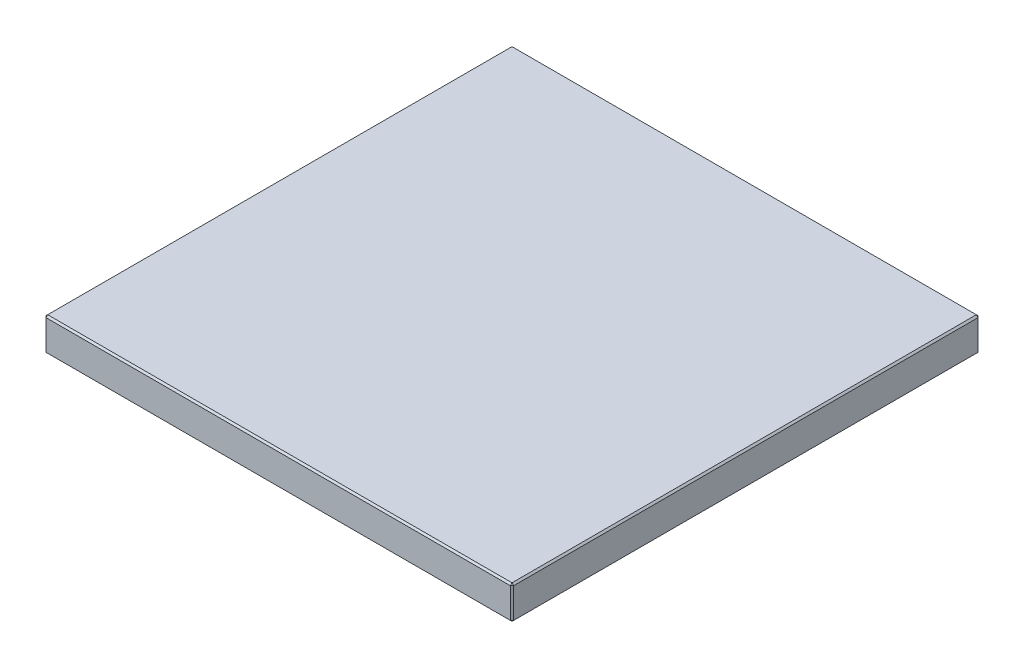
ISO-10303-21;
HEADER;
FILE_DESCRIPTION(('STEP AP214'),'2;1');
FILE_NAME('part.step','',(''),(''),'','','');
FILE_SCHEMA(('AUTOMOTIVE_DESIGN { 1 0 10303 214 1 1 1 1 }'));
ENDSEC;
DATA;
#1=APPLICATION_CONTEXT('core data for automotive mechanical design processes');
#2=APPLICATION_PROTOCOL_DEFINITION('international standard','automotive_design',2000,#1);
#3=PRODUCT_CONTEXT('',#1,'mechanical');
#4=PRODUCT('Part','Part','',(#3));
#5=PRODUCT_RELATED_PRODUCT_CATEGORY('part','',(#4));
#6=PRODUCT_DEFINITION_FORMATION('','',#4);
#7=PRODUCT_DEFINITION_CONTEXT('part definition',#1,'design');
#8=PRODUCT_DEFINITION('design','',#6,#7);
#9=PRODUCT_DEFINITION_SHAPE('','',#8);
#10=(LENGTH_UNIT() NAMED_UNIT(*) SI_UNIT(.MILLI.,.METRE.));
#11=(NAMED_UNIT(*) PLANE_ANGLE_UNIT() SI_UNIT($,.RADIAN.));
#12=(NAMED_UNIT(*) SI_UNIT($,.STERADIAN.) SOLID_ANGLE_UNIT());
#13=UNCERTAINTY_MEASURE_WITH_UNIT(LENGTH_MEASURE(1.E-05),#10,'distance_accuracy_value','');
#14=(GEOMETRIC_REPRESENTATION_CONTEXT(3) GLOBAL_UNCERTAINTY_ASSIGNED_CONTEXT((#13)) GLOBAL_UNIT_ASSIGNED_CONTEXT((#10,
#11,#12)) REPRESENTATION_CONTEXT('',''));
#15=CARTESIAN_POINT('',(0.,0.,0.));
#16=DIRECTION('',(0.,0.,1.));
#17=DIRECTION('',(1.,0.,0.));
#18=AXIS2_PLACEMENT_3D('',#15,#16,#17);
#19=CARTESIAN_POINT('',(44.45,-3.17500000000001,44.45));
#20=DIRECTION('',(-1.,0.,0.));
#21=DIRECTION('',(0.,0.,1.));
#22=AXIS2_PLACEMENT_3D('',#19,#20,#21);
#23=PLANE('',#22);
#24=DIRECTION('',(0.,-1.,0.));
#25=VECTOR('',#24,1.);
#26=CARTESIAN_POINT('',(44.45,-3.17500000000001,44.1325));
#27=LINE('',#26,#25);
#28=CARTESIAN_POINT('',(44.45,2.85750000000002,44.1325));
#29=VERTEX_POINT('',#28);
#30=CARTESIAN_POINT('',(44.45,-2.85750000000001,44.1325));
#31=VERTEX_POINT('',#30);
#32=EDGE_CURVE('E151',#29,#31,#27,.T.);
#33=ORIENTED_EDGE('',*,*,#32,.T.);
#34=DIRECTION('',(0.,0.,-1.));
#35=VECTOR('',#34,1.);
#36=CARTESIAN_POINT('',(44.45,-2.85750000000001,44.45));
#37=LINE('',#36,#35);
#38=CARTESIAN_POINT('',(44.45,-2.85750000000001,-44.1325));
#39=VERTEX_POINT('',#38);
#40=EDGE_CURVE('E218',#31,#39,#37,.T.);
#41=ORIENTED_EDGE('',*,*,#40,.T.);
#42=DIRECTION('',(0.,1.,0.));
#43=VECTOR('',#42,1.);
#44=CARTESIAN_POINT('',(44.45,3.17500000000002,-44.1325));
#45=LINE('',#44,#43);
#46=CARTESIAN_POINT('',(44.45,2.85750000000002,-44.1325));
#47=VERTEX_POINT('',#46);
#48=EDGE_CURVE('E215',#39,#47,#45,.T.);
#49=ORIENTED_EDGE('',*,*,#48,.T.);
#50=DIRECTION('',(0.,0.,1.));
#51=VECTOR('',#50,1.);
#52=CARTESIAN_POINT('',(44.45,2.85750000000002,44.45));
#53=LINE('',#52,#51);
#54=EDGE_CURVE('E210',#47,#29,#53,.T.);
#55=ORIENTED_EDGE('',*,*,#54,.T.);
#56=EDGE_LOOP('',(#33,#41,#49,#55));
#57=FACE_BOUND('',#56,.T.);
#58=ADVANCED_FACE('F41',(#57),#23,.F.);
#59=CARTESIAN_POINT('',(-44.45,3.175,44.45));
#60=DIRECTION('',(0.,-1.,0.));
#61=DIRECTION('',(1.,0.,0.));
#62=AXIS2_PLACEMENT_3D('',#59,#60,#61);
#63=PLANE('',#62);
#64=DIRECTION('',(0.,0.,-1.));
#65=VECTOR('',#64,1.);
#66=CARTESIAN_POINT('',(44.1325,3.17500000000002,44.45));
#67=LINE('',#66,#65);
#68=CARTESIAN_POINT('',(44.1325,3.17500000000002,44.1325));
#69=VERTEX_POINT('',#68);
#70=CARTESIAN_POINT('',(44.1325,3.17500000000002,-44.1325));
#71=VERTEX_POINT('',#70);
#72=EDGE_CURVE('E65',#69,#71,#67,.T.);
#73=ORIENTED_EDGE('',*,*,#72,.T.);
#74=DIRECTION('',(-1.,0.,0.));
#75=VECTOR('',#74,1.);
#76=CARTESIAN_POINT('',(-44.45,3.175,-44.1325));
#77=LINE('',#76,#75);
#78=CARTESIAN_POINT('',(-44.1325,3.175,-44.1325));
#79=VERTEX_POINT('',#78);
#80=EDGE_CURVE('E11',#71,#79,#77,.T.);
#81=ORIENTED_EDGE('',*,*,#80,.T.);
#82=DIRECTION('',(0.,0.,1.));
#83=VECTOR('',#82,1.);
#84=CARTESIAN_POINT('',(-44.1325,3.175,44.45));
#85=LINE('',#84,#83);
#86=CARTESIAN_POINT('',(-44.1325,3.175,44.1325));
#87=VERTEX_POINT('',#86);
#88=EDGE_CURVE('E51',#79,#87,#85,.T.);
#89=ORIENTED_EDGE('',*,*,#88,.T.);
#90=DIRECTION('',(1.,0.,0.));
#91=VECTOR('',#90,1.);
#92=CARTESIAN_POINT('',(-44.45,3.175,44.1325));
#93=LINE('',#92,#91);
#94=EDGE_CURVE('E235',#87,#69,#93,.T.);
#95=ORIENTED_EDGE('',*,*,#94,.T.);
#96=EDGE_LOOP('',(#73,#81,#89,#95));
#97=FACE_BOUND('',#96,.T.);
#98=ADVANCED_FACE('F362',(#97),#63,.F.);
#99=CARTESIAN_POINT('',(-44.45,-3.17500000000002,44.45));
#100=DIRECTION('',(1.,0.,0.));
#101=DIRECTION('',(0.,0.,-1.));
#102=AXIS2_PLACEMENT_3D('',#99,#100,#101);
#103=PLANE('',#102);
#104=DIRECTION('',(0.,0.,1.));
#105=VECTOR('',#104,1.);
#106=CARTESIAN_POINT('',(-44.45,-2.85750000000002,44.45));
#107=LINE('',#106,#105);
#108=CARTESIAN_POINT('',(-44.45,-2.85750000000002,-44.1325));
#109=VERTEX_POINT('',#108);
#110=CARTESIAN_POINT('',(-44.45,-2.85750000000002,44.1325));
#111=VERTEX_POINT('',#110);
#112=EDGE_CURVE('E190',#109,#111,#107,.T.);
#113=ORIENTED_EDGE('',*,*,#112,.T.);
#114=DIRECTION('',(0.,1.,0.));
#115=VECTOR('',#114,1.);
#116=CARTESIAN_POINT('',(-44.45,-3.17500000000002,44.1325));
#117=LINE('',#116,#115);
#118=CARTESIAN_POINT('',(-44.45,2.8575,44.1325));
#119=VERTEX_POINT('',#118);
#120=EDGE_CURVE('E193',#111,#119,#117,.T.);
#121=ORIENTED_EDGE('',*,*,#120,.T.);
#122=DIRECTION('',(0.,0.,-1.));
#123=VECTOR('',#122,1.);
#124=CARTESIAN_POINT('',(-44.45,2.8575,44.45));
#125=LINE('',#124,#123);
#126=CARTESIAN_POINT('',(-44.45,2.8575,-44.1325));
#127=VERTEX_POINT('',#126);
#128=EDGE_CURVE('E184',#119,#127,#125,.T.);
#129=ORIENTED_EDGE('',*,*,#128,.T.);
#130=DIRECTION('',(0.,-1.,0.));
#131=VECTOR('',#130,1.);
#132=CARTESIAN_POINT('',(-44.45,-3.17500000000002,-44.1325));
#133=LINE('',#132,#131);
#134=EDGE_CURVE('E187',#127,#109,#133,.T.);
#135=ORIENTED_EDGE('',*,*,#134,.T.);
#136=EDGE_LOOP('',(#113,#121,#129,#135));
#137=FACE_BOUND('',#136,.T.);
#138=ADVANCED_FACE('F386',(#137),#103,.F.);
#139=CARTESIAN_POINT('',(-44.45,-3.17500000000002,44.45));
#140=DIRECTION('',(0.,1.,0.));
#141=DIRECTION('',(-1.,0.,0.));
#142=AXIS2_PLACEMENT_3D('',#139,#140,#141);
#143=PLANE('',#142);
#144=DIRECTION('',(0.,0.,1.));
#145=VECTOR('',#144,1.);
#146=CARTESIAN_POINT('',(44.1325,-3.17500000000001,44.45));
#147=LINE('',#146,#145);
#148=CARTESIAN_POINT('',(44.1325,-3.17500000000001,-44.1325));
#149=VERTEX_POINT('',#148);
#150=CARTESIAN_POINT('',(44.1325,-3.17500000000001,44.1325));
#151=VERTEX_POINT('',#150);
#152=EDGE_CURVE('E200',#149,#151,#147,.T.);
#153=ORIENTED_EDGE('',*,*,#152,.T.);
#154=DIRECTION('',(-1.,0.,0.));
#155=VECTOR('',#154,1.);
#156=CARTESIAN_POINT('',(-44.45,-3.17500000000002,44.1325));
#157=LINE('',#156,#155);
#158=CARTESIAN_POINT('',(-44.1325,-3.17500000000002,44.1325));
#159=VERTEX_POINT('',#158);
#160=EDGE_CURVE('E207',#151,#159,#157,.T.);
#161=ORIENTED_EDGE('',*,*,#160,.T.);
#162=DIRECTION('',(0.,0.,-1.));
#163=VECTOR('',#162,1.);
#164=CARTESIAN_POINT('',(-44.1325,-3.17500000000002,44.45));
#165=LINE('',#164,#163);
#166=CARTESIAN_POINT('',(-44.1325,-3.17500000000002,-44.1325));
#167=VERTEX_POINT('',#166);
#168=EDGE_CURVE('E203',#159,#167,#165,.T.);
#169=ORIENTED_EDGE('',*,*,#168,.T.);
#170=DIRECTION('',(1.,0.,0.));
#171=VECTOR('',#170,1.);
#172=CARTESIAN_POINT('',(44.45,-3.17500000000001,-44.1325));
#173=LINE('',#172,#171);
#174=EDGE_CURVE('E197',#167,#149,#173,.T.);
#175=ORIENTED_EDGE('',*,*,#174,.T.);
#176=EDGE_LOOP('',(#153,#161,#169,#175));
#177=FACE_BOUND('',#176,.T.);
#178=ADVANCED_FACE('F335',(#177),#143,.F.);
#179=CARTESIAN_POINT('',(0.,0.,44.45));
#180=DIRECTION('',(0.,0.,-1.));
#181=DIRECTION('',(-1.,0.,0.));
#182=AXIS2_PLACEMENT_3D('',#179,#180,#181);
#183=PLANE('',#182);
#184=DIRECTION('',(-1.,0.,0.));
#185=VECTOR('',#184,1.);
#186=CARTESIAN_POINT('',(0.,2.85750000000001,44.45));
#187=LINE('',#186,#185);
#188=CARTESIAN_POINT('',(44.1325,2.85750000000002,44.45));
#189=VERTEX_POINT('',#188);
#190=CARTESIAN_POINT('',(-44.1325,2.8575,44.45));
#191=VERTEX_POINT('',#190);
#192=EDGE_CURVE('E137',#189,#191,#187,.T.);
#193=ORIENTED_EDGE('',*,*,#192,.T.);
#194=DIRECTION('',(0.,-1.,0.));
#195=VECTOR('',#194,1.);
#196=CARTESIAN_POINT('',(-44.1325,0.,44.45));
#197=LINE('',#196,#195);
#198=CARTESIAN_POINT('',(-44.1325,-2.85750000000002,44.45));
#199=VERTEX_POINT('',#198);
#200=EDGE_CURVE('E181',#191,#199,#197,.T.);
#201=ORIENTED_EDGE('',*,*,#200,.T.);
#202=DIRECTION('',(1.,0.,0.));
#203=VECTOR('',#202,1.);
#204=CARTESIAN_POINT('',(0.,-2.85750000000002,44.45));
#205=LINE('',#204,#203);
#206=CARTESIAN_POINT('',(44.1325,-2.85750000000001,44.45));
#207=VERTEX_POINT('',#206);
#208=EDGE_CURVE('E140',#199,#207,#205,.T.);
#209=ORIENTED_EDGE('',*,*,#208,.T.);
#210=DIRECTION('',(0.,1.,0.));
#211=VECTOR('',#210,1.);
#212=CARTESIAN_POINT('',(44.1325,0.,44.45));
#213=LINE('',#212,#211);
#214=EDGE_CURVE('E132',#207,#189,#213,.T.);
#215=ORIENTED_EDGE('',*,*,#214,.T.);
#216=EDGE_LOOP('',(#193,#201,#209,#215));
#217=FACE_BOUND('',#216,.T.);
#218=ADVANCED_FACE('F134',(#217),#183,.F.);
#219=CARTESIAN_POINT('',(0.,0.,-44.45));
#220=DIRECTION('',(0.,0.,-1.));
#221=DIRECTION('',(-1.,0.,0.));
#222=AXIS2_PLACEMENT_3D('',#219,#220,#221);
#223=PLANE('',#222);
#224=DIRECTION('',(0.,-1.,0.));
#225=VECTOR('',#224,1.);
#226=CARTESIAN_POINT('',(44.1325,-3.17500000000001,-44.45));
#227=LINE('',#226,#225);
#228=CARTESIAN_POINT('',(44.1325,2.85750000000002,-44.45));
#229=VERTEX_POINT('',#228);
#230=CARTESIAN_POINT('',(44.1325,-2.85750000000001,-44.45));
#231=VERTEX_POINT('',#230);
#232=EDGE_CURVE('E225',#229,#231,#227,.T.);
#233=ORIENTED_EDGE('',*,*,#232,.T.);
#234=DIRECTION('',(-1.,0.,0.));
#235=VECTOR('',#234,1.);
#236=CARTESIAN_POINT('',(-44.45,-2.85750000000002,-44.45));
#237=LINE('',#236,#235);
#238=CARTESIAN_POINT('',(-44.1325,-2.85750000000002,-44.45));
#239=VERTEX_POINT('',#238);
#240=EDGE_CURVE('E231',#231,#239,#237,.T.);
#241=ORIENTED_EDGE('',*,*,#240,.T.);
#242=DIRECTION('',(0.,1.,0.));
#243=VECTOR('',#242,1.);
#244=CARTESIAN_POINT('',(-44.1325,3.175,-44.45));
#245=LINE('',#244,#243);
#246=CARTESIAN_POINT('',(-44.1325,2.8575,-44.45));
#247=VERTEX_POINT('',#246);
#248=EDGE_CURVE('E228',#239,#247,#245,.T.);
#249=ORIENTED_EDGE('',*,*,#248,.T.);
#250=DIRECTION('',(1.,0.,0.));
#251=VECTOR('',#250,1.);
#252=CARTESIAN_POINT('',(44.45,2.85750000000002,-44.45));
#253=LINE('',#252,#251);
#254=EDGE_CURVE('E222',#247,#229,#253,.T.);
#255=ORIENTED_EDGE('',*,*,#254,.T.);
#256=EDGE_LOOP('',(#233,#241,#249,#255));
#257=FACE_BOUND('',#256,.T.);
#258=ADVANCED_FACE('F351',(#257),#223,.T.);
#259=CARTESIAN_POINT('',(44.45,-3.17500000000001,-44.1325));
#260=DIRECTION('',(0.707106781186548,0.,-0.707106781186548));
#261=DIRECTION('',(0.,-1.,0.));
#262=AXIS2_PLACEMENT_3D('',#259,#260,#261);
#263=PLANE('',#262);
#264=DIRECTION('',(-0.707106781186548,0.,-0.707106781186548));
#265=VECTOR('',#264,1.);
#266=CARTESIAN_POINT('',(44.45,2.85750000000002,-44.1325));
#267=LINE('',#266,#265);
#268=EDGE_CURVE('E45',#47,#229,#267,.T.);
#269=ORIENTED_EDGE('',*,*,#268,.F.);
#270=ORIENTED_EDGE('',*,*,#48,.F.);
#271=DIRECTION('',(0.707106781186547,0.,0.707106781186547));
#272=VECTOR('',#271,1.);
#273=CARTESIAN_POINT('',(44.45,-2.85750000000001,-44.1325));
#274=LINE('',#273,#272);
#275=EDGE_CURVE('E177',#231,#39,#274,.T.);
#276=ORIENTED_EDGE('',*,*,#275,.F.);
#277=ORIENTED_EDGE('',*,*,#232,.F.);
#278=EDGE_LOOP('',(#269,#270,#276,#277));
#279=FACE_BOUND('',#278,.T.);
#280=ADVANCED_FACE('F43',(#279),#263,.T.);
#281=CARTESIAN_POINT('',(44.45,2.85750000000002,-44.1325));
#282=DIRECTION('',(0.577350269189625,0.577350269189626,-0.577350269189626));
#283=DIRECTION('',(0.,0.707106781186548,0.707106781186548));
#284=AXIS2_PLACEMENT_3D('',#281,#282,#283);
#285=PLANE('',#284);
#286=DIRECTION('',(-0.707106781186548,0.707106781186547,0.));
#287=VECTOR('',#286,1.);
#288=CARTESIAN_POINT('',(44.45,2.85750000000002,-44.1325));
#289=LINE('',#288,#287);
#290=EDGE_CURVE('E300',#47,#71,#289,.T.);
#291=ORIENTED_EDGE('',*,*,#290,.F.);
#292=ORIENTED_EDGE('',*,*,#268,.T.);
#293=DIRECTION('',(0.,0.707106781186547,0.707106781186548));
#294=VECTOR('',#293,1.);
#295=CARTESIAN_POINT('',(44.1325,3.01625000000002,-44.29125));
#296=LINE('',#295,#294);
#297=EDGE_CURVE('E303',#71,#229,#296,.F.);
#298=ORIENTED_EDGE('',*,*,#297,.F.);
#299=EDGE_LOOP('',(#291,#292,#298));
#300=FACE_BOUND('',#299,.T.);
#301=ADVANCED_FACE('F355',(#300),#285,.T.);
#302=CARTESIAN_POINT('',(44.45,-2.85750000000001,-44.1325));
#303=DIRECTION('',(0.577350269189626,-0.577350269189626,-0.577350269189626));
#304=DIRECTION('',(-0.707106781186548,0.,-0.707106781186548));
#305=AXIS2_PLACEMENT_3D('',#302,#303,#304);
#306=PLANE('',#305);
#307=DIRECTION('',(0.,0.707106781186548,-0.707106781186548));
#308=VECTOR('',#307,1.);
#309=CARTESIAN_POINT('',(44.1325,-3.01625000000001,-44.29125));
#310=LINE('',#309,#308);
#311=EDGE_CURVE('E293',#231,#149,#310,.F.);
#312=ORIENTED_EDGE('',*,*,#311,.F.);
#313=ORIENTED_EDGE('',*,*,#275,.T.);
#314=DIRECTION('',(0.707106781186547,0.707106781186547,0.));
#315=VECTOR('',#314,1.);
#316=CARTESIAN_POINT('',(44.45,-2.85750000000001,-44.1325));
#317=LINE('',#316,#315);
#318=EDGE_CURVE('E297',#149,#39,#317,.T.);
#319=ORIENTED_EDGE('',*,*,#318,.F.);
#320=EDGE_LOOP('',(#312,#313,#319));
#321=FACE_BOUND('',#320,.T.);
#322=ADVANCED_FACE('F314',(#321),#306,.T.);
#323=CARTESIAN_POINT('',(-44.45,3.175,-44.1325));
#324=DIRECTION('',(0.,0.707106781186548,-0.707106781186547));
#325=DIRECTION('',(1.,0.,0.));
#326=AXIS2_PLACEMENT_3D('',#323,#324,#325);
#327=PLANE('',#326);
#328=ORIENTED_EDGE('',*,*,#297,.T.);
#329=ORIENTED_EDGE('',*,*,#254,.F.);
#330=DIRECTION('',(0.,-0.707106781186547,-0.707106781186548));
#331=VECTOR('',#330,1.);
#332=CARTESIAN_POINT('',(-44.1325,2.8575,-44.45));
#333=LINE('',#332,#331);
#334=EDGE_CURVE('E285',#79,#247,#333,.T.);
#335=ORIENTED_EDGE('',*,*,#334,.F.);
#336=ORIENTED_EDGE('',*,*,#80,.F.);
#337=EDGE_LOOP('',(#328,#329,#335,#336));
#338=FACE_BOUND('',#337,.T.);
#339=ADVANCED_FACE('F359',(#338),#327,.T.);
#340=CARTESIAN_POINT('',(44.1325,3.17500000000002,44.45));
#341=DIRECTION('',(-0.707106781186547,-0.707106781186548,0.));
#342=DIRECTION('',(0.,0.,-1.));
#343=AXIS2_PLACEMENT_3D('',#340,#341,#342);
#344=PLANE('',#343);
#345=ORIENTED_EDGE('',*,*,#290,.T.);
#346=ORIENTED_EDGE('',*,*,#72,.F.);
#347=DIRECTION('',(0.707106781186548,-0.707106781186547,0.));
#348=VECTOR('',#347,1.);
#349=CARTESIAN_POINT('',(44.29125,3.01625000000002,44.1325));
#350=LINE('',#349,#348);
#351=EDGE_CURVE('E156',#29,#69,#350,.F.);
#352=ORIENTED_EDGE('',*,*,#351,.F.);
#353=ORIENTED_EDGE('',*,*,#54,.F.);
#354=EDGE_LOOP('',(#345,#346,#352,#353));
#355=FACE_BOUND('',#354,.T.);
#356=ADVANCED_FACE('F427',(#355),#344,.F.);
#357=CARTESIAN_POINT('',(44.1325,0.,44.45));
#358=DIRECTION('',(-0.707106781186548,0.,-0.707106781186548));
#359=DIRECTION('',(0.,1.,0.));
#360=AXIS2_PLACEMENT_3D('',#357,#358,#359);
#361=PLANE('',#360);
#362=DIRECTION('',(0.707106781186547,0.,-0.707106781186547));
#363=VECTOR('',#362,1.);
#364=CARTESIAN_POINT('',(44.29125,-2.85750000000001,44.29125));
#365=LINE('',#364,#363);
#366=EDGE_CURVE('E157',#31,#207,#365,.F.);
#367=ORIENTED_EDGE('',*,*,#366,.F.);
#368=ORIENTED_EDGE('',*,*,#32,.F.);
#369=DIRECTION('',(-0.707106781186548,0.,0.707106781186548));
#370=VECTOR('',#369,1.);
#371=CARTESIAN_POINT('',(44.1325,2.85750000000002,44.45));
#372=LINE('',#371,#370);
#373=EDGE_CURVE('E148',#189,#29,#372,.F.);
#374=ORIENTED_EDGE('',*,*,#373,.F.);
#375=ORIENTED_EDGE('',*,*,#214,.F.);
#376=EDGE_LOOP('',(#367,#368,#374,#375));
#377=FACE_BOUND('',#376,.T.);
#378=ADVANCED_FACE('F150',(#377),#361,.F.);
#379=CARTESIAN_POINT('',(44.45,-2.85750000000001,44.45));
#380=DIRECTION('',(-0.707106781186548,0.707106781186548,0.));
#381=DIRECTION('',(0.,0.,-1.));
#382=AXIS2_PLACEMENT_3D('',#379,#380,#381);
#383=PLANE('',#382);
#384=ORIENTED_EDGE('',*,*,#318,.T.);
#385=ORIENTED_EDGE('',*,*,#40,.F.);
#386=DIRECTION('',(-0.707106781186547,-0.707106781186547,0.));
#387=VECTOR('',#386,1.);
#388=CARTESIAN_POINT('',(44.1325,-3.17500000000001,44.1325));
#389=LINE('',#388,#387);
#390=EDGE_CURVE('E277',#151,#31,#389,.F.);
#391=ORIENTED_EDGE('',*,*,#390,.F.);
#392=ORIENTED_EDGE('',*,*,#152,.F.);
#393=EDGE_LOOP('',(#384,#385,#391,#392));
#394=FACE_BOUND('',#393,.T.);
#395=ADVANCED_FACE('F325',(#394),#383,.F.);
#396=CARTESIAN_POINT('',(-44.45,-3.17500000000002,-44.1325));
#397=DIRECTION('',(0.,-0.707106781186548,-0.707106781186548));
#398=DIRECTION('',(-1.,0.,0.));
#399=AXIS2_PLACEMENT_3D('',#396,#397,#398);
#400=PLANE('',#399);
#401=ORIENTED_EDGE('',*,*,#311,.T.);
#402=ORIENTED_EDGE('',*,*,#174,.F.);
#403=DIRECTION('',(0.,-0.707106781186547,0.707106781186547));
#404=VECTOR('',#403,1.);
#405=CARTESIAN_POINT('',(-44.1325,-3.17500000000002,-44.1325));
#406=LINE('',#405,#404);
#407=EDGE_CURVE('E273',#239,#167,#406,.T.);
#408=ORIENTED_EDGE('',*,*,#407,.F.);
#409=ORIENTED_EDGE('',*,*,#240,.F.);
#410=EDGE_LOOP('',(#401,#402,#408,#409));
#411=FACE_BOUND('',#410,.T.);
#412=ADVANCED_FACE('F349',(#411),#400,.T.);
#413=CARTESIAN_POINT('',(-44.45,-3.17500000000002,-44.1325));
#414=DIRECTION('',(-0.707106781186548,0.,-0.707106781186548));
#415=DIRECTION('',(0.,1.,0.));
#416=AXIS2_PLACEMENT_3D('',#413,#414,#415);
#417=PLANE('',#416);
#418=DIRECTION('',(-0.707106781186547,0.,0.707106781186547));
#419=VECTOR('',#418,1.);
#420=CARTESIAN_POINT('',(-44.1325,2.8575,-44.45));
#421=LINE('',#420,#419);
#422=EDGE_CURVE('E289',#247,#127,#421,.T.);
#423=ORIENTED_EDGE('',*,*,#422,.F.);
#424=ORIENTED_EDGE('',*,*,#248,.F.);
#425=DIRECTION('',(0.707106781186547,0.,-0.707106781186547));
#426=VECTOR('',#425,1.);
#427=CARTESIAN_POINT('',(-44.29125,-2.85750000000002,-44.29125));
#428=LINE('',#427,#426);
#429=EDGE_CURVE('E270',#109,#239,#428,.T.);
#430=ORIENTED_EDGE('',*,*,#429,.F.);
#431=ORIENTED_EDGE('',*,*,#134,.F.);
#432=EDGE_LOOP('',(#423,#424,#430,#431));
#433=FACE_BOUND('',#432,.T.);
#434=ADVANCED_FACE('F453',(#433),#417,.T.);
#435=CARTESIAN_POINT('',(-44.1325,2.8575,-44.45));
#436=DIRECTION('',(-0.577350269189626,0.577350269189626,-0.577350269189626));
#437=DIRECTION('',(-0.707106781186548,0.,0.707106781186548));
#438=AXIS2_PLACEMENT_3D('',#435,#436,#437);
#439=PLANE('',#438);
#440=ORIENTED_EDGE('',*,*,#334,.T.);
#441=ORIENTED_EDGE('',*,*,#422,.T.);
#442=DIRECTION('',(-0.707106781186547,-0.707106781186547,0.));
#443=VECTOR('',#442,1.);
#444=CARTESIAN_POINT('',(-44.29125,3.01625,-44.1325));
#445=LINE('',#444,#443);
#446=EDGE_CURVE('E165',#79,#127,#445,.T.);
#447=ORIENTED_EDGE('',*,*,#446,.F.);
#448=EDGE_LOOP('',(#440,#441,#447));
#449=FACE_BOUND('',#448,.T.);
#450=ADVANCED_FACE('F460',(#449),#439,.T.);
#451=CARTESIAN_POINT('',(44.1325,2.85750000000002,44.45));
#452=DIRECTION('',(0.577350269189626,0.577350269189626,0.577350269189626));
#453=DIRECTION('',(0.,-0.707106781186547,0.707106781186548));
#454=AXIS2_PLACEMENT_3D('',#451,#452,#453);
#455=PLANE('',#454);
#456=ORIENTED_EDGE('',*,*,#373,.T.);
#457=ORIENTED_EDGE('',*,*,#351,.T.);
#458=DIRECTION('',(0.,0.707106781186547,-0.707106781186548));
#459=VECTOR('',#458,1.);
#460=CARTESIAN_POINT('',(44.1325,2.85750000000002,44.45));
#461=LINE('',#460,#459);
#462=EDGE_CURVE('E160',#189,#69,#461,.T.);
#463=ORIENTED_EDGE('',*,*,#462,.F.);
#464=EDGE_LOOP('',(#456,#457,#463));
#465=FACE_BOUND('',#464,.T.);
#466=ADVANCED_FACE('F161',(#465),#455,.T.);
#467=CARTESIAN_POINT('',(44.1325,-3.17500000000001,44.1325));
#468=DIRECTION('',(0.577350269189626,-0.577350269189626,0.577350269189626));
#469=DIRECTION('',(0.707106781186548,0.,-0.707106781186548));
#470=AXIS2_PLACEMENT_3D('',#467,#468,#469);
#471=PLANE('',#470);
#472=ORIENTED_EDGE('',*,*,#390,.T.);
#473=ORIENTED_EDGE('',*,*,#366,.T.);
#474=DIRECTION('',(0.,0.707106781186548,0.707106781186548));
#475=VECTOR('',#474,1.);
#476=CARTESIAN_POINT('',(44.1325,-3.17500000000001,44.1325));
#477=LINE('',#476,#475);
#478=EDGE_CURVE('E166',#151,#207,#477,.T.);
#479=ORIENTED_EDGE('',*,*,#478,.F.);
#480=EDGE_LOOP('',(#472,#473,#479));
#481=FACE_BOUND('',#480,.T.);
#482=ADVANCED_FACE('F328',(#481),#471,.T.);
#483=CARTESIAN_POINT('',(-44.1325,-3.17500000000002,-44.1325));
#484=DIRECTION('',(-0.577350269189626,-0.577350269189626,-0.577350269189626));
#485=DIRECTION('',(-0.707106781186548,0.,0.707106781186548));
#486=AXIS2_PLACEMENT_3D('',#483,#484,#485);
#487=PLANE('',#486);
#488=ORIENTED_EDGE('',*,*,#429,.T.);
#489=ORIENTED_EDGE('',*,*,#407,.T.);
#490=DIRECTION('',(0.707106781186547,-0.707106781186547,0.));
#491=VECTOR('',#490,1.);
#492=CARTESIAN_POINT('',(-44.1325,-3.17500000000002,-44.1325));
#493=LINE('',#492,#491);
#494=EDGE_CURVE('E262',#109,#167,#493,.T.);
#495=ORIENTED_EDGE('',*,*,#494,.F.);
#496=EDGE_LOOP('',(#488,#489,#495));
#497=FACE_BOUND('',#496,.T.);
#498=ADVANCED_FACE('F345',(#497),#487,.T.);
#499=CARTESIAN_POINT('',(-44.45,2.8575,44.45));
#500=DIRECTION('',(0.707106781186548,-0.707106781186548,0.));
#501=DIRECTION('',(0.,0.,-1.));
#502=AXIS2_PLACEMENT_3D('',#499,#500,#501);
#503=PLANE('',#502);
#504=ORIENTED_EDGE('',*,*,#446,.T.);
#505=ORIENTED_EDGE('',*,*,#128,.F.);
#506=DIRECTION('',(0.707106781186548,0.707106781186548,0.));
#507=VECTOR('',#506,1.);
#508=CARTESIAN_POINT('',(-44.45,2.8575,44.1325));
#509=LINE('',#508,#507);
#510=EDGE_CURVE('E258',#87,#119,#509,.F.);
#511=ORIENTED_EDGE('',*,*,#510,.F.);
#512=ORIENTED_EDGE('',*,*,#88,.F.);
#513=EDGE_LOOP('',(#504,#505,#511,#512));
#514=FACE_BOUND('',#513,.T.);
#515=ADVANCED_FACE('F364',(#514),#503,.F.);
#516=CARTESIAN_POINT('',(0.,2.85750000000001,44.45));
#517=DIRECTION('',(0.,-0.707106781186548,-0.707106781186547));
#518=DIRECTION('',(-1.,0.,0.));
#519=AXIS2_PLACEMENT_3D('',#516,#517,#518);
#520=PLANE('',#519);
#521=ORIENTED_EDGE('',*,*,#462,.T.);
#522=ORIENTED_EDGE('',*,*,#94,.F.);
#523=DIRECTION('',(0.,-0.707106781186547,0.707106781186548));
#524=VECTOR('',#523,1.);
#525=CARTESIAN_POINT('',(-44.1325,3.01625,44.29125));
#526=LINE('',#525,#524);
#527=EDGE_CURVE('E170',#191,#87,#526,.F.);
#528=ORIENTED_EDGE('',*,*,#527,.F.);
#529=ORIENTED_EDGE('',*,*,#192,.F.);
#530=EDGE_LOOP('',(#521,#522,#528,#529));
#531=FACE_BOUND('',#530,.T.);
#532=ADVANCED_FACE('F168',(#531),#520,.F.);
#533=CARTESIAN_POINT('',(0.,-2.85750000000002,44.45));
#534=DIRECTION('',(0.,0.707106781186548,-0.707106781186548));
#535=DIRECTION('',(1.,0.,0.));
#536=AXIS2_PLACEMENT_3D('',#533,#534,#535);
#537=PLANE('',#536);
#538=ORIENTED_EDGE('',*,*,#478,.T.);
#539=ORIENTED_EDGE('',*,*,#208,.F.);
#540=DIRECTION('',(0.,-0.707106781186547,-0.707106781186547));
#541=VECTOR('',#540,1.);
#542=CARTESIAN_POINT('',(-44.1325,-2.85750000000002,44.45));
#543=LINE('',#542,#541);
#544=EDGE_CURVE('E252',#159,#199,#543,.F.);
#545=ORIENTED_EDGE('',*,*,#544,.F.);
#546=ORIENTED_EDGE('',*,*,#160,.F.);
#547=EDGE_LOOP('',(#538,#539,#545,#546));
#548=FACE_BOUND('',#547,.T.);
#549=ADVANCED_FACE('F332',(#548),#537,.F.);
#550=CARTESIAN_POINT('',(-44.1325,-3.17500000000002,44.45));
#551=DIRECTION('',(0.707106781186548,0.707106781186548,0.));
#552=DIRECTION('',(0.,0.,-1.));
#553=AXIS2_PLACEMENT_3D('',#550,#551,#552);
#554=PLANE('',#553);
#555=ORIENTED_EDGE('',*,*,#494,.T.);
#556=ORIENTED_EDGE('',*,*,#168,.F.);
#557=DIRECTION('',(-0.707106781186547,0.707106781186547,0.));
#558=VECTOR('',#557,1.);
#559=CARTESIAN_POINT('',(-44.29125,-3.01625000000002,44.1325));
#560=LINE('',#559,#558);
#561=EDGE_CURVE('E248',#111,#159,#560,.F.);
#562=ORIENTED_EDGE('',*,*,#561,.F.);
#563=ORIENTED_EDGE('',*,*,#112,.F.);
#564=EDGE_LOOP('',(#555,#556,#562,#563));
#565=FACE_BOUND('',#564,.T.);
#566=ADVANCED_FACE('F338',(#565),#554,.F.);
#567=CARTESIAN_POINT('',(-44.45,2.8575,44.1325));
#568=DIRECTION('',(-0.577350269189626,0.577350269189626,0.577350269189625));
#569=DIRECTION('',(-0.707106781186548,-0.707106781186548,0.));
#570=AXIS2_PLACEMENT_3D('',#567,#568,#569);
#571=PLANE('',#570);
#572=ORIENTED_EDGE('',*,*,#527,.T.);
#573=ORIENTED_EDGE('',*,*,#510,.T.);
#574=DIRECTION('',(-0.707106781186548,0.,-0.707106781186548));
#575=VECTOR('',#574,1.);
#576=CARTESIAN_POINT('',(-44.45,2.8575,44.1325));
#577=LINE('',#576,#575);
#578=EDGE_CURVE('E245',#191,#119,#577,.T.);
#579=ORIENTED_EDGE('',*,*,#578,.F.);
#580=EDGE_LOOP('',(#572,#573,#579));
#581=FACE_BOUND('',#580,.T.);
#582=ADVANCED_FACE('F366',(#581),#571,.T.);
#583=CARTESIAN_POINT('',(-44.1325,-2.85750000000002,44.45));
#584=DIRECTION('',(-0.577350269189626,-0.577350269189626,0.577350269189626));
#585=DIRECTION('',(0.707106781186548,0.,0.707106781186548));
#586=AXIS2_PLACEMENT_3D('',#583,#584,#585);
#587=PLANE('',#586);
#588=ORIENTED_EDGE('',*,*,#561,.T.);
#589=ORIENTED_EDGE('',*,*,#544,.T.);
#590=DIRECTION('',(0.707106781186547,0.,0.707106781186547));
#591=VECTOR('',#590,1.);
#592=CARTESIAN_POINT('',(-44.1325,-2.85750000000002,44.45));
#593=LINE('',#592,#591);
#594=EDGE_CURVE('E242',#111,#199,#593,.T.);
#595=ORIENTED_EDGE('',*,*,#594,.F.);
#596=EDGE_LOOP('',(#588,#589,#595));
#597=FACE_BOUND('',#596,.T.);
#598=ADVANCED_FACE('F372',(#597),#587,.T.);
#599=CARTESIAN_POINT('',(-44.1325,0.,44.45));
#600=DIRECTION('',(0.707106781186548,0.,-0.707106781186548));
#601=DIRECTION('',(0.,-1.,0.));
#602=AXIS2_PLACEMENT_3D('',#599,#600,#601);
#603=PLANE('',#602);
#604=ORIENTED_EDGE('',*,*,#578,.T.);
#605=ORIENTED_EDGE('',*,*,#120,.F.);
#606=ORIENTED_EDGE('',*,*,#594,.T.);
#607=ORIENTED_EDGE('',*,*,#200,.F.);
#608=EDGE_LOOP('',(#604,#605,#606,#607));
#609=FACE_BOUND('',#608,.T.);
#610=ADVANCED_FACE('F369',(#609),#603,.F.);
#611=CLOSED_SHELL('',(#58,#98,#138,#178,#218,#258,#280,#301,#322,#339,#356,#378,#395,#412,#434,
#450,#466,#482,#498,#515,#532,#549,#566,#582,#598,#610));
#612=MANIFOLD_SOLID_BREP('B2',#611);
#613=ADVANCED_BREP_SHAPE_REPRESENTATION('',(#18,#612),#14);
#614=SHAPE_DEFINITION_REPRESENTATION(#9,#613);
ENDSEC;
END-ISO-10303-21;
